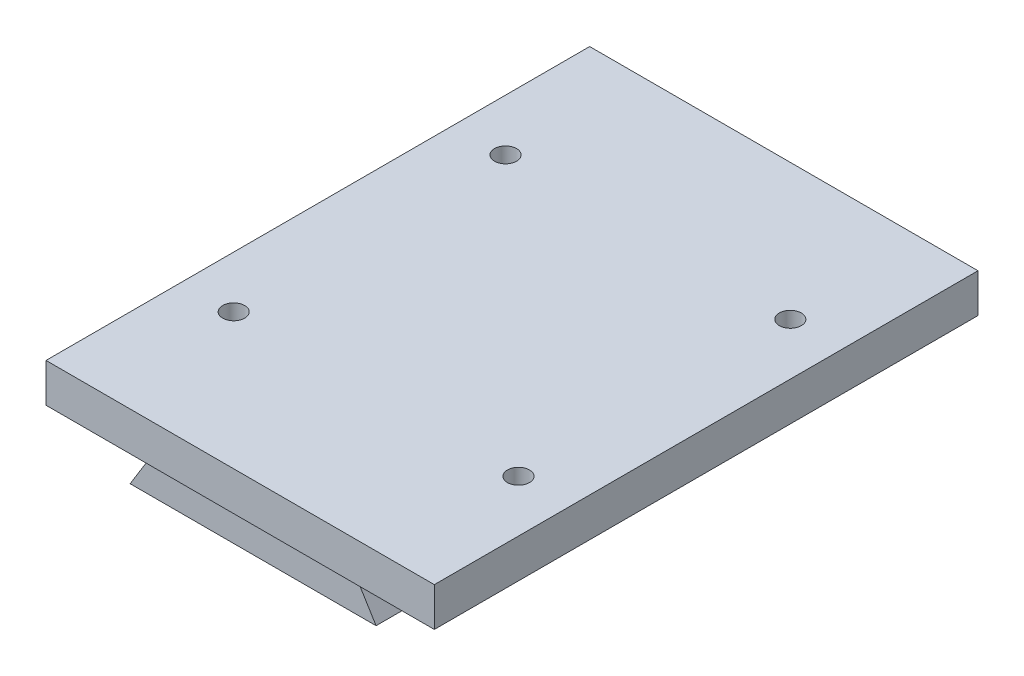
ISO-10303-21;
HEADER;
FILE_DESCRIPTION(('STEP AP214'),'2;1');
FILE_NAME('part.step','',(''),(''),'','','');
FILE_SCHEMA(('AUTOMOTIVE_DESIGN { 1 0 10303 214 1 1 1 1 }'));
ENDSEC;
DATA;
#1=APPLICATION_CONTEXT('core data for automotive mechanical design processes');
#2=APPLICATION_PROTOCOL_DEFINITION('international standard','automotive_design',2000,#1);
#3=PRODUCT_CONTEXT('',#1,'mechanical');
#4=PRODUCT('Part','Part','',(#3));
#5=PRODUCT_RELATED_PRODUCT_CATEGORY('part','',(#4));
#6=PRODUCT_DEFINITION_FORMATION('','',#4);
#7=PRODUCT_DEFINITION_CONTEXT('part definition',#1,'design');
#8=PRODUCT_DEFINITION('design','',#6,#7);
#9=PRODUCT_DEFINITION_SHAPE('','',#8);
#10=(LENGTH_UNIT() NAMED_UNIT(*) SI_UNIT(.MILLI.,.METRE.));
#11=(NAMED_UNIT(*) PLANE_ANGLE_UNIT() SI_UNIT($,.RADIAN.));
#12=(NAMED_UNIT(*) SI_UNIT($,.STERADIAN.) SOLID_ANGLE_UNIT());
#13=UNCERTAINTY_MEASURE_WITH_UNIT(LENGTH_MEASURE(1.E-05),#10,'distance_accuracy_value','');
#14=(GEOMETRIC_REPRESENTATION_CONTEXT(3) GLOBAL_UNCERTAINTY_ASSIGNED_CONTEXT((#13)) GLOBAL_UNIT_ASSIGNED_CONTEXT((#10,
#11,#12)) REPRESENTATION_CONTEXT('',''));
#15=CARTESIAN_POINT('',(0.,0.,0.));
#16=DIRECTION('',(0.,0.,1.));
#17=DIRECTION('',(1.,0.,0.));
#18=AXIS2_PLACEMENT_3D('',#15,#16,#17);
#19=CARTESIAN_POINT('',(0.,-34.4,0.));
#20=DIRECTION('',(0.,1.,0.));
#21=DIRECTION('',(0.,0.,1.));
#22=AXIS2_PLACEMENT_3D('',#19,#20,#21);
#23=PLANE('',#22);
#24=CARTESIAN_POINT('',(-22.,-34.4,49.));
#25=DIRECTION('',(0.,1.,0.));
#26=DIRECTION('',(0.,0.,1.));
#27=AXIS2_PLACEMENT_3D('',#24,#25,#26);
#28=CIRCLE('',#27,3.);
#29=CARTESIAN_POINT('',(-22.,-34.4,52.));
#30=VERTEX_POINT('',#29);
#31=EDGE_CURVE('E43',#30,#30,#28,.F.);
#32=ORIENTED_EDGE('',*,*,#31,.F.);
#33=EDGE_LOOP('',(#32));
#34=FACE_BOUND('',#33,.T.);
#35=CARTESIAN_POINT('',(22.,-34.4,91.));
#36=DIRECTION('',(0.,1.,0.));
#37=DIRECTION('',(0.,0.,1.));
#38=AXIS2_PLACEMENT_3D('',#35,#36,#37);
#39=CIRCLE('',#38,3.);
#40=CARTESIAN_POINT('',(22.,-34.4,94.));
#41=VERTEX_POINT('',#40);
#42=EDGE_CURVE('E199',#41,#41,#39,.F.);
#43=ORIENTED_EDGE('',*,*,#42,.F.);
#44=EDGE_LOOP('',(#43));
#45=FACE_BOUND('',#44,.T.);
#46=CARTESIAN_POINT('',(22.,-34.4,49.));
#47=DIRECTION('',(0.,1.,0.));
#48=DIRECTION('',(0.,0.,1.));
#49=AXIS2_PLACEMENT_3D('',#46,#47,#48);
#50=CIRCLE('',#49,3.);
#51=CARTESIAN_POINT('',(22.,-34.4,52.));
#52=VERTEX_POINT('',#51);
#53=EDGE_CURVE('E197',#52,#52,#50,.F.);
#54=ORIENTED_EDGE('',*,*,#53,.F.);
#55=EDGE_LOOP('',(#54));
#56=FACE_BOUND('',#55,.T.);
#57=CARTESIAN_POINT('',(-22.,-34.4,91.));
#58=DIRECTION('',(0.,1.,0.));
#59=DIRECTION('',(0.,0.,1.));
#60=AXIS2_PLACEMENT_3D('',#57,#58,#59);
#61=CIRCLE('',#60,3.);
#62=CARTESIAN_POINT('',(-22.,-34.4,94.));
#63=VERTEX_POINT('',#62);
#64=EDGE_CURVE('E194',#63,#63,#61,.F.);
#65=ORIENTED_EDGE('',*,*,#64,.F.);
#66=EDGE_LOOP('',(#65));
#67=FACE_BOUND('',#66,.T.);
#68=DIRECTION('',(0.,0.,1.));
#69=VECTOR('',#68,1.);
#70=CARTESIAN_POINT('',(-30.,-34.4,28.));
#71=LINE('',#70,#69);
#72=CARTESIAN_POINT('',(-30.,-34.4,28.));
#73=VERTEX_POINT('',#72);
#74=CARTESIAN_POINT('',(-30.,-34.4,112.));
#75=VERTEX_POINT('',#74);
#76=EDGE_CURVE('E136',#73,#75,#71,.T.);
#77=ORIENTED_EDGE('',*,*,#76,.F.);
#78=DIRECTION('',(-1.,0.,0.));
#79=VECTOR('',#78,1.);
#80=CARTESIAN_POINT('',(30.,-34.4,28.));
#81=LINE('',#80,#79);
#82=CARTESIAN_POINT('',(30.,-34.4,28.));
#83=VERTEX_POINT('',#82);
#84=EDGE_CURVE('E86',#83,#73,#81,.T.);
#85=ORIENTED_EDGE('',*,*,#84,.F.);
#86=DIRECTION('',(0.,0.,-1.));
#87=VECTOR('',#86,1.);
#88=CARTESIAN_POINT('',(30.,-34.4,112.));
#89=LINE('',#88,#87);
#90=CARTESIAN_POINT('',(30.,-34.4,112.));
#91=VERTEX_POINT('',#90);
#92=EDGE_CURVE('E152',#91,#83,#89,.T.);
#93=ORIENTED_EDGE('',*,*,#92,.F.);
#94=DIRECTION('',(1.,0.,0.));
#95=VECTOR('',#94,1.);
#96=CARTESIAN_POINT('',(-30.,-34.4,112.));
#97=LINE('',#96,#95);
#98=EDGE_CURVE('E139',#75,#91,#97,.T.);
#99=ORIENTED_EDGE('',*,*,#98,.F.);
#100=EDGE_LOOP('',(#77,#85,#93,#99));
#101=FACE_BOUND('',#100,.T.);
#102=DIRECTION('',(-1.,0.,0.));
#103=VECTOR('',#102,1.);
#104=CARTESIAN_POINT('',(0.,-34.4,110.));
#105=LINE('',#104,#103);
#106=CARTESIAN_POINT('',(15.3076923076923,-34.4,110.));
#107=VERTEX_POINT('',#106);
#108=CARTESIAN_POINT('',(-15.3076923076923,-34.4,110.));
#109=VERTEX_POINT('',#108);
#110=EDGE_CURVE('E11',#107,#109,#105,.T.);
#111=ORIENTED_EDGE('',*,*,#110,.F.);
#112=DIRECTION('',(0.,0.,1.));
#113=VECTOR('',#112,1.);
#114=CARTESIAN_POINT('',(15.3076923076923,-34.4,0.));
#115=LINE('',#114,#113);
#116=CARTESIAN_POINT('',(15.3076923076923,-34.4,30.));
#117=VERTEX_POINT('',#116);
#118=EDGE_CURVE('E166',#117,#107,#115,.T.);
#119=ORIENTED_EDGE('',*,*,#118,.F.);
#120=DIRECTION('',(-1.,0.,0.));
#121=VECTOR('',#120,1.);
#122=CARTESIAN_POINT('',(0.,-34.4,30.));
#123=LINE('',#122,#121);
#124=CARTESIAN_POINT('',(-15.3076923076923,-34.4,30.));
#125=VERTEX_POINT('',#124);
#126=EDGE_CURVE('E163',#117,#125,#123,.T.);
#127=ORIENTED_EDGE('',*,*,#126,.T.);
#128=DIRECTION('',(0.,0.,-1.));
#129=VECTOR('',#128,1.);
#130=CARTESIAN_POINT('',(-15.3076923076923,-34.4,0.));
#131=LINE('',#130,#129);
#132=EDGE_CURVE('E48',#109,#125,#131,.T.);
#133=ORIENTED_EDGE('',*,*,#132,.F.);
#134=EDGE_LOOP('',(#111,#119,#127,#133));
#135=FACE_BOUND('',#134,.T.);
#136=ADVANCED_FACE('F39',(#34,#45,#56,#67,#101,#135),#23,.F.);
#137=CARTESIAN_POINT('',(-30.,-28.4,28.));
#138=DIRECTION('',(1.,0.,0.));
#139=DIRECTION('',(0.,0.,-1.));
#140=AXIS2_PLACEMENT_3D('',#137,#138,#139);
#141=PLANE('',#140);
#142=ORIENTED_EDGE('',*,*,#76,.T.);
#143=DIRECTION('',(0.,-1.,0.));
#144=VECTOR('',#143,1.);
#145=CARTESIAN_POINT('',(-30.,-28.4,112.));
#146=LINE('',#145,#144);
#147=CARTESIAN_POINT('',(-30.,-28.4,112.));
#148=VERTEX_POINT('',#147);
#149=EDGE_CURVE('E161',#148,#75,#146,.T.);
#150=ORIENTED_EDGE('',*,*,#149,.F.);
#151=DIRECTION('',(0.,0.,1.));
#152=VECTOR('',#151,1.);
#153=CARTESIAN_POINT('',(-30.,-28.4,28.));
#154=LINE('',#153,#152);
#155=CARTESIAN_POINT('',(-30.,-28.4,28.));
#156=VERTEX_POINT('',#155);
#157=EDGE_CURVE('E144',#156,#148,#154,.T.);
#158=ORIENTED_EDGE('',*,*,#157,.F.);
#159=DIRECTION('',(0.,-1.,0.));
#160=VECTOR('',#159,1.);
#161=CARTESIAN_POINT('',(-30.,-28.4,28.));
#162=LINE('',#161,#160);
#163=EDGE_CURVE('E149',#156,#73,#162,.T.);
#164=ORIENTED_EDGE('',*,*,#163,.T.);
#165=EDGE_LOOP('',(#142,#150,#158,#164));
#166=FACE_BOUND('',#165,.T.);
#167=ADVANCED_FACE('F41',(#166),#141,.F.);
#168=CARTESIAN_POINT('',(-30.,-28.4,112.));
#169=DIRECTION('',(0.,0.,-1.));
#170=DIRECTION('',(-1.,0.,0.));
#171=AXIS2_PLACEMENT_3D('',#168,#169,#170);
#172=PLANE('',#171);
#173=ORIENTED_EDGE('',*,*,#98,.T.);
#174=DIRECTION('',(0.,-1.,0.));
#175=VECTOR('',#174,1.);
#176=CARTESIAN_POINT('',(30.,-28.4,112.));
#177=LINE('',#176,#175);
#178=CARTESIAN_POINT('',(30.,-28.4,112.));
#179=VERTEX_POINT('',#178);
#180=EDGE_CURVE('E158',#179,#91,#177,.T.);
#181=ORIENTED_EDGE('',*,*,#180,.F.);
#182=DIRECTION('',(1.,0.,0.));
#183=VECTOR('',#182,1.);
#184=CARTESIAN_POINT('',(-30.,-28.4,112.));
#185=LINE('',#184,#183);
#186=EDGE_CURVE('E94',#148,#179,#185,.T.);
#187=ORIENTED_EDGE('',*,*,#186,.F.);
#188=ORIENTED_EDGE('',*,*,#149,.T.);
#189=EDGE_LOOP('',(#173,#181,#187,#188));
#190=FACE_BOUND('',#189,.T.);
#191=ADVANCED_FACE('F311',(#190),#172,.F.);
#192=CARTESIAN_POINT('',(30.,-28.4,112.));
#193=DIRECTION('',(-1.,0.,0.));
#194=DIRECTION('',(0.,0.,1.));
#195=AXIS2_PLACEMENT_3D('',#192,#193,#194);
#196=PLANE('',#195);
#197=ORIENTED_EDGE('',*,*,#92,.T.);
#198=DIRECTION('',(0.,-1.,0.));
#199=VECTOR('',#198,1.);
#200=CARTESIAN_POINT('',(30.,-28.4,28.));
#201=LINE('',#200,#199);
#202=CARTESIAN_POINT('',(30.,-28.4,28.));
#203=VERTEX_POINT('',#202);
#204=EDGE_CURVE('E156',#203,#83,#201,.T.);
#205=ORIENTED_EDGE('',*,*,#204,.F.);
#206=DIRECTION('',(0.,0.,-1.));
#207=VECTOR('',#206,1.);
#208=CARTESIAN_POINT('',(30.,-28.4,112.));
#209=LINE('',#208,#207);
#210=EDGE_CURVE('E147',#179,#203,#209,.T.);
#211=ORIENTED_EDGE('',*,*,#210,.F.);
#212=ORIENTED_EDGE('',*,*,#180,.T.);
#213=EDGE_LOOP('',(#197,#205,#211,#212));
#214=FACE_BOUND('',#213,.T.);
#215=ADVANCED_FACE('F309',(#214),#196,.F.);
#216=CARTESIAN_POINT('',(30.,-28.4,28.));
#217=DIRECTION('',(0.,0.,1.));
#218=DIRECTION('',(1.,0.,0.));
#219=AXIS2_PLACEMENT_3D('',#216,#217,#218);
#220=PLANE('',#219);
#221=ORIENTED_EDGE('',*,*,#84,.T.);
#222=ORIENTED_EDGE('',*,*,#163,.F.);
#223=DIRECTION('',(-1.,0.,0.));
#224=VECTOR('',#223,1.);
#225=CARTESIAN_POINT('',(30.,-28.4,28.));
#226=LINE('',#225,#224);
#227=EDGE_CURVE('E65',#203,#156,#226,.T.);
#228=ORIENTED_EDGE('',*,*,#227,.F.);
#229=ORIENTED_EDGE('',*,*,#204,.T.);
#230=EDGE_LOOP('',(#221,#222,#228,#229));
#231=FACE_BOUND('',#230,.T.);
#232=ADVANCED_FACE('F304',(#231),#220,.F.);
#233=CARTESIAN_POINT('',(0.,-28.4,0.));
#234=DIRECTION('',(0.,1.,0.));
#235=DIRECTION('',(0.,0.,1.));
#236=AXIS2_PLACEMENT_3D('',#233,#234,#235);
#237=PLANE('',#236);
#238=CARTESIAN_POINT('',(-22.,-28.4,49.));
#239=DIRECTION('',(0.,1.,0.));
#240=DIRECTION('',(0.,0.,1.));
#241=AXIS2_PLACEMENT_3D('',#238,#239,#240);
#242=CIRCLE('',#241,1.7);
#243=CARTESIAN_POINT('',(-22.,-28.4,50.7));
#244=VERTEX_POINT('',#243);
#245=EDGE_CURVE('E178',#244,#244,#242,.F.);
#246=ORIENTED_EDGE('',*,*,#245,.T.);
#247=EDGE_LOOP('',(#246));
#248=FACE_BOUND('',#247,.T.);
#249=CARTESIAN_POINT('',(22.,-28.4,91.));
#250=DIRECTION('',(0.,1.,0.));
#251=DIRECTION('',(0.,0.,1.));
#252=AXIS2_PLACEMENT_3D('',#249,#250,#251);
#253=CIRCLE('',#252,1.7);
#254=CARTESIAN_POINT('',(22.,-28.4,92.7));
#255=VERTEX_POINT('',#254);
#256=EDGE_CURVE('E175',#255,#255,#253,.F.);
#257=ORIENTED_EDGE('',*,*,#256,.T.);
#258=EDGE_LOOP('',(#257));
#259=FACE_BOUND('',#258,.T.);
#260=CARTESIAN_POINT('',(22.,-28.4,49.));
#261=DIRECTION('',(0.,1.,0.));
#262=DIRECTION('',(0.,0.,1.));
#263=AXIS2_PLACEMENT_3D('',#260,#261,#262);
#264=CIRCLE('',#263,1.7);
#265=CARTESIAN_POINT('',(22.,-28.4,50.7));
#266=VERTEX_POINT('',#265);
#267=EDGE_CURVE('E172',#266,#266,#264,.F.);
#268=ORIENTED_EDGE('',*,*,#267,.T.);
#269=EDGE_LOOP('',(#268));
#270=FACE_BOUND('',#269,.T.);
#271=CARTESIAN_POINT('',(-22.,-28.4,91.));
#272=DIRECTION('',(0.,1.,0.));
#273=DIRECTION('',(0.,0.,1.));
#274=AXIS2_PLACEMENT_3D('',#271,#272,#273);
#275=CIRCLE('',#274,1.7);
#276=CARTESIAN_POINT('',(-22.,-28.4,92.7));
#277=VERTEX_POINT('',#276);
#278=EDGE_CURVE('E169',#277,#277,#275,.F.);
#279=ORIENTED_EDGE('',*,*,#278,.T.);
#280=EDGE_LOOP('',(#279));
#281=FACE_BOUND('',#280,.T.);
#282=ORIENTED_EDGE('',*,*,#157,.T.);
#283=ORIENTED_EDGE('',*,*,#186,.T.);
#284=ORIENTED_EDGE('',*,*,#210,.T.);
#285=ORIENTED_EDGE('',*,*,#227,.T.);
#286=EDGE_LOOP('',(#282,#283,#284,#285));
#287=FACE_BOUND('',#286,.T.);
#288=ADVANCED_FACE('F302',(#248,#259,#270,#281,#287),#237,.T.);
#289=CARTESIAN_POINT('',(-19.,-40.4,110.));
#290=DIRECTION('',(0.851658316704544,-0.524097425664335,0.));
#291=DIRECTION('',(0.524097425664335,0.851658316704544,0.));
#292=AXIS2_PLACEMENT_3D('',#289,#290,#291);
#293=PLANE('',#292);
#294=DIRECTION('',(-0.524097425664335,-0.851658316704544,0.));
#295=VECTOR('',#294,1.);
#296=CARTESIAN_POINT('',(-19.,-40.4,110.));
#297=LINE('',#296,#295);
#298=CARTESIAN_POINT('',(-19.,-40.4,110.));
#299=VERTEX_POINT('',#298);
#300=EDGE_CURVE('E114',#109,#299,#297,.T.);
#301=ORIENTED_EDGE('',*,*,#300,.F.);
#302=ORIENTED_EDGE('',*,*,#132,.T.);
#303=DIRECTION('',(-0.524097425664335,-0.851658316704544,0.));
#304=VECTOR('',#303,1.);
#305=CARTESIAN_POINT('',(-19.,-40.4,30.));
#306=LINE('',#305,#304);
#307=CARTESIAN_POINT('',(-19.,-40.4,30.));
#308=VERTEX_POINT('',#307);
#309=EDGE_CURVE('E56',#125,#308,#306,.T.);
#310=ORIENTED_EDGE('',*,*,#309,.T.);
#311=DIRECTION('',(0.,0.,-1.));
#312=VECTOR('',#311,1.);
#313=CARTESIAN_POINT('',(-19.,-40.4,110.));
#314=LINE('',#313,#312);
#315=EDGE_CURVE('E129',#299,#308,#314,.T.);
#316=ORIENTED_EDGE('',*,*,#315,.F.);
#317=EDGE_LOOP('',(#301,#302,#310,#316));
#318=FACE_BOUND('',#317,.T.);
#319=ADVANCED_FACE('F135',(#318),#293,.F.);
#320=CARTESIAN_POINT('',(15.,-33.9,110.));
#321=DIRECTION('',(-0.851658316704544,-0.524097425664335,0.));
#322=DIRECTION('',(0.524097425664335,-0.851658316704544,0.));
#323=AXIS2_PLACEMENT_3D('',#320,#321,#322);
#324=PLANE('',#323);
#325=DIRECTION('',(-0.524097425664335,0.851658316704544,0.));
#326=VECTOR('',#325,1.);
#327=CARTESIAN_POINT('',(15.,-33.9,30.));
#328=LINE('',#327,#326);
#329=CARTESIAN_POINT('',(19.,-40.4,30.));
#330=VERTEX_POINT('',#329);
#331=EDGE_CURVE('E124',#330,#117,#328,.T.);
#332=ORIENTED_EDGE('',*,*,#331,.T.);
#333=ORIENTED_EDGE('',*,*,#118,.T.);
#334=DIRECTION('',(-0.524097425664335,0.851658316704544,0.));
#335=VECTOR('',#334,1.);
#336=CARTESIAN_POINT('',(15.,-33.9,110.));
#337=LINE('',#336,#335);
#338=CARTESIAN_POINT('',(19.,-40.4,110.));
#339=VERTEX_POINT('',#338);
#340=EDGE_CURVE('E133',#339,#107,#337,.T.);
#341=ORIENTED_EDGE('',*,*,#340,.F.);
#342=DIRECTION('',(0.,0.,-1.));
#343=VECTOR('',#342,1.);
#344=CARTESIAN_POINT('',(19.,-40.4,110.));
#345=LINE('',#344,#343);
#346=EDGE_CURVE('E131',#339,#330,#345,.T.);
#347=ORIENTED_EDGE('',*,*,#346,.T.);
#348=EDGE_LOOP('',(#332,#333,#341,#347));
#349=FACE_BOUND('',#348,.T.);
#350=ADVANCED_FACE('F223',(#349),#324,.F.);
#351=CARTESIAN_POINT('',(0.,0.,110.));
#352=DIRECTION('',(0.,0.,-1.));
#353=DIRECTION('',(-1.,0.,0.));
#354=AXIS2_PLACEMENT_3D('',#351,#352,#353);
#355=PLANE('',#354);
#356=ORIENTED_EDGE('',*,*,#340,.T.);
#357=ORIENTED_EDGE('',*,*,#110,.T.);
#358=ORIENTED_EDGE('',*,*,#300,.T.);
#359=DIRECTION('',(1.,0.,0.));
#360=VECTOR('',#359,1.);
#361=CARTESIAN_POINT('',(19.,-40.4,110.));
#362=LINE('',#361,#360);
#363=EDGE_CURVE('E118',#299,#339,#362,.T.);
#364=ORIENTED_EDGE('',*,*,#363,.T.);
#365=EDGE_LOOP('',(#356,#357,#358,#364));
#366=FACE_BOUND('',#365,.T.);
#367=ADVANCED_FACE('F117',(#366),#355,.F.);
#368=CARTESIAN_POINT('',(0.,0.,30.));
#369=DIRECTION('',(0.,0.,-1.));
#370=DIRECTION('',(-1.,0.,0.));
#371=AXIS2_PLACEMENT_3D('',#368,#369,#370);
#372=PLANE('',#371);
#373=ORIENTED_EDGE('',*,*,#126,.F.);
#374=ORIENTED_EDGE('',*,*,#331,.F.);
#375=DIRECTION('',(1.,0.,0.));
#376=VECTOR('',#375,1.);
#377=CARTESIAN_POINT('',(19.,-40.4,30.));
#378=LINE('',#377,#376);
#379=EDGE_CURVE('E224',#308,#330,#378,.T.);
#380=ORIENTED_EDGE('',*,*,#379,.F.);
#381=ORIENTED_EDGE('',*,*,#309,.F.);
#382=EDGE_LOOP('',(#373,#374,#380,#381));
#383=FACE_BOUND('',#382,.T.);
#384=ADVANCED_FACE('F221',(#383),#372,.T.);
#385=CARTESIAN_POINT('',(19.,-40.4,110.));
#386=DIRECTION('',(0.,1.,0.));
#387=DIRECTION('',(0.,0.,1.));
#388=AXIS2_PLACEMENT_3D('',#385,#386,#387);
#389=PLANE('',#388);
#390=ORIENTED_EDGE('',*,*,#379,.T.);
#391=ORIENTED_EDGE('',*,*,#346,.F.);
#392=ORIENTED_EDGE('',*,*,#363,.F.);
#393=ORIENTED_EDGE('',*,*,#315,.T.);
#394=EDGE_LOOP('',(#390,#391,#392,#393));
#395=FACE_BOUND('',#394,.T.);
#396=ADVANCED_FACE('F128',(#395),#389,.F.);
#397=CARTESIAN_POINT('',(-22.,-27.9,91.));
#398=DIRECTION('',(0.,-1.,0.));
#399=DIRECTION('',(0.,0.,-1.));
#400=AXIS2_PLACEMENT_3D('',#397,#398,#399);
#401=CYLINDRICAL_SURFACE('',#400,1.7);
#402=CARTESIAN_POINT('',(-22.,-30.9,91.));
#403=DIRECTION('',(0.,1.,0.));
#404=DIRECTION('',(0.,0.,1.));
#405=AXIS2_PLACEMENT_3D('',#402,#403,#404);
#406=CIRCLE('',#405,1.7);
#407=CARTESIAN_POINT('',(-22.,-30.9,92.7));
#408=VERTEX_POINT('',#407);
#409=EDGE_CURVE('E191',#408,#408,#406,.T.);
#410=ORIENTED_EDGE('',*,*,#409,.F.);
#411=EDGE_LOOP('',(#410));
#412=FACE_BOUND('',#411,.T.);
#413=ORIENTED_EDGE('',*,*,#278,.F.);
#414=EDGE_LOOP('',(#413));
#415=FACE_BOUND('',#414,.T.);
#416=ADVANCED_FACE('F281',(#412,#415),#401,.F.);
#417=CARTESIAN_POINT('',(22.,-27.9,49.));
#418=DIRECTION('',(0.,-1.,0.));
#419=DIRECTION('',(0.,0.,-1.));
#420=AXIS2_PLACEMENT_3D('',#417,#418,#419);
#421=CYLINDRICAL_SURFACE('',#420,1.7);
#422=CARTESIAN_POINT('',(22.,-30.9,49.));
#423=DIRECTION('',(0.,1.,0.));
#424=DIRECTION('',(0.,0.,1.));
#425=AXIS2_PLACEMENT_3D('',#422,#423,#424);
#426=CIRCLE('',#425,1.7);
#427=CARTESIAN_POINT('',(22.,-30.9,50.7));
#428=VERTEX_POINT('',#427);
#429=EDGE_CURVE('E188',#428,#428,#426,.T.);
#430=ORIENTED_EDGE('',*,*,#429,.F.);
#431=EDGE_LOOP('',(#430));
#432=FACE_BOUND('',#431,.T.);
#433=ORIENTED_EDGE('',*,*,#267,.F.);
#434=EDGE_LOOP('',(#433));
#435=FACE_BOUND('',#434,.T.);
#436=ADVANCED_FACE('F277',(#432,#435),#421,.F.);
#437=CARTESIAN_POINT('',(22.,-27.9,91.));
#438=DIRECTION('',(0.,-1.,0.));
#439=DIRECTION('',(0.,0.,-1.));
#440=AXIS2_PLACEMENT_3D('',#437,#438,#439);
#441=CYLINDRICAL_SURFACE('',#440,1.7);
#442=CARTESIAN_POINT('',(22.,-30.9,91.));
#443=DIRECTION('',(0.,1.,0.));
#444=DIRECTION('',(0.,0.,1.));
#445=AXIS2_PLACEMENT_3D('',#442,#443,#444);
#446=CIRCLE('',#445,1.7);
#447=CARTESIAN_POINT('',(22.,-30.9,92.7));
#448=VERTEX_POINT('',#447);
#449=EDGE_CURVE('E184',#448,#448,#446,.T.);
#450=ORIENTED_EDGE('',*,*,#449,.F.);
#451=EDGE_LOOP('',(#450));
#452=FACE_BOUND('',#451,.T.);
#453=ORIENTED_EDGE('',*,*,#256,.F.);
#454=EDGE_LOOP('',(#453));
#455=FACE_BOUND('',#454,.T.);
#456=ADVANCED_FACE('F280',(#452,#455),#441,.F.);
#457=CARTESIAN_POINT('',(-22.,-27.9,49.));
#458=DIRECTION('',(0.,-1.,0.));
#459=DIRECTION('',(0.,0.,-1.));
#460=AXIS2_PLACEMENT_3D('',#457,#458,#459);
#461=CYLINDRICAL_SURFACE('',#460,1.7);
#462=CARTESIAN_POINT('',(-22.,-30.9,49.));
#463=DIRECTION('',(0.,1.,0.));
#464=DIRECTION('',(0.,0.,1.));
#465=AXIS2_PLACEMENT_3D('',#462,#463,#464);
#466=CIRCLE('',#465,1.7);
#467=CARTESIAN_POINT('',(-22.,-30.9,50.7));
#468=VERTEX_POINT('',#467);
#469=EDGE_CURVE('E181',#468,#468,#466,.T.);
#470=ORIENTED_EDGE('',*,*,#469,.F.);
#471=EDGE_LOOP('',(#470));
#472=FACE_BOUND('',#471,.T.);
#473=ORIENTED_EDGE('',*,*,#245,.F.);
#474=EDGE_LOOP('',(#473));
#475=FACE_BOUND('',#474,.T.);
#476=ADVANCED_FACE('F262',(#472,#475),#461,.F.);
#477=CARTESIAN_POINT('',(-22.,-30.9,49.));
#478=DIRECTION('',(0.,-1.,0.));
#479=DIRECTION('',(0.,0.,-1.));
#480=AXIS2_PLACEMENT_3D('',#477,#478,#479);
#481=CYLINDRICAL_SURFACE('',#480,3.);
#482=CARTESIAN_POINT('',(-22.,-30.9,49.));
#483=DIRECTION('',(0.,1.,0.));
#484=DIRECTION('',(0.,0.,1.));
#485=AXIS2_PLACEMENT_3D('',#482,#483,#484);
#486=CIRCLE('',#485,3.);
#487=CARTESIAN_POINT('',(-22.,-30.9,52.));
#488=VERTEX_POINT('',#487);
#489=EDGE_CURVE('E231',#488,#488,#486,.T.);
#490=ORIENTED_EDGE('',*,*,#489,.T.);
#491=EDGE_LOOP('',(#490));
#492=FACE_BOUND('',#491,.T.);
#493=ORIENTED_EDGE('',*,*,#31,.T.);
#494=EDGE_LOOP('',(#493));
#495=FACE_BOUND('',#494,.T.);
#496=ADVANCED_FACE('F206',(#492,#495),#481,.F.);
#497=CARTESIAN_POINT('',(-22.,-30.9,49.));
#498=DIRECTION('',(0.,1.,0.));
#499=DIRECTION('',(0.,0.,1.));
#500=AXIS2_PLACEMENT_3D('',#497,#498,#499);
#501=PLANE('',#500);
#502=ORIENTED_EDGE('',*,*,#469,.T.);
#503=EDGE_LOOP('',(#502));
#504=FACE_BOUND('',#503,.T.);
#505=ORIENTED_EDGE('',*,*,#489,.F.);
#506=EDGE_LOOP('',(#505));
#507=FACE_BOUND('',#506,.T.);
#508=ADVANCED_FACE('F261',(#504,#507),#501,.F.);
#509=CARTESIAN_POINT('',(22.,-30.9,91.));
#510=DIRECTION('',(0.,-1.,0.));
#511=DIRECTION('',(0.,0.,-1.));
#512=AXIS2_PLACEMENT_3D('',#509,#510,#511);
#513=CYLINDRICAL_SURFACE('',#512,3.);
#514=CARTESIAN_POINT('',(22.,-30.9,91.));
#515=DIRECTION('',(0.,1.,0.));
#516=DIRECTION('',(0.,0.,1.));
#517=AXIS2_PLACEMENT_3D('',#514,#515,#516);
#518=CIRCLE('',#517,3.);
#519=CARTESIAN_POINT('',(22.,-30.9,94.));
#520=VERTEX_POINT('',#519);
#521=EDGE_CURVE('E232',#520,#520,#518,.T.);
#522=ORIENTED_EDGE('',*,*,#521,.T.);
#523=EDGE_LOOP('',(#522));
#524=FACE_BOUND('',#523,.T.);
#525=ORIENTED_EDGE('',*,*,#42,.T.);
#526=EDGE_LOOP('',(#525));
#527=FACE_BOUND('',#526,.T.);
#528=ADVANCED_FACE('F266',(#524,#527),#513,.F.);
#529=CARTESIAN_POINT('',(22.,-30.9,91.));
#530=DIRECTION('',(0.,1.,0.));
#531=DIRECTION('',(0.,0.,1.));
#532=AXIS2_PLACEMENT_3D('',#529,#530,#531);
#533=PLANE('',#532);
#534=ORIENTED_EDGE('',*,*,#449,.T.);
#535=EDGE_LOOP('',(#534));
#536=FACE_BOUND('',#535,.T.);
#537=ORIENTED_EDGE('',*,*,#521,.F.);
#538=EDGE_LOOP('',(#537));
#539=FACE_BOUND('',#538,.T.);
#540=ADVANCED_FACE('F256',(#536,#539),#533,.F.);
#541=CARTESIAN_POINT('',(22.,-30.9,49.));
#542=DIRECTION('',(0.,-1.,0.));
#543=DIRECTION('',(0.,0.,-1.));
#544=AXIS2_PLACEMENT_3D('',#541,#542,#543);
#545=CYLINDRICAL_SURFACE('',#544,3.);
#546=CARTESIAN_POINT('',(22.,-30.9,49.));
#547=DIRECTION('',(0.,1.,0.));
#548=DIRECTION('',(0.,0.,1.));
#549=AXIS2_PLACEMENT_3D('',#546,#547,#548);
#550=CIRCLE('',#549,3.);
#551=CARTESIAN_POINT('',(22.,-30.9,52.));
#552=VERTEX_POINT('',#551);
#553=EDGE_CURVE('E235',#552,#552,#550,.T.);
#554=ORIENTED_EDGE('',*,*,#553,.T.);
#555=EDGE_LOOP('',(#554));
#556=FACE_BOUND('',#555,.T.);
#557=ORIENTED_EDGE('',*,*,#53,.T.);
#558=EDGE_LOOP('',(#557));
#559=FACE_BOUND('',#558,.T.);
#560=ADVANCED_FACE('F241',(#556,#559),#545,.F.);
#561=CARTESIAN_POINT('',(22.,-30.9,49.));
#562=DIRECTION('',(0.,1.,0.));
#563=DIRECTION('',(0.,0.,1.));
#564=AXIS2_PLACEMENT_3D('',#561,#562,#563);
#565=PLANE('',#564);
#566=ORIENTED_EDGE('',*,*,#429,.T.);
#567=EDGE_LOOP('',(#566));
#568=FACE_BOUND('',#567,.T.);
#569=ORIENTED_EDGE('',*,*,#553,.F.);
#570=EDGE_LOOP('',(#569));
#571=FACE_BOUND('',#570,.T.);
#572=ADVANCED_FACE('F244',(#568,#571),#565,.F.);
#573=CARTESIAN_POINT('',(-22.,-30.9,91.));
#574=DIRECTION('',(0.,-1.,0.));
#575=DIRECTION('',(0.,0.,-1.));
#576=AXIS2_PLACEMENT_3D('',#573,#574,#575);
#577=CYLINDRICAL_SURFACE('',#576,3.);
#578=CARTESIAN_POINT('',(-22.,-30.9,91.));
#579=DIRECTION('',(0.,1.,0.));
#580=DIRECTION('',(0.,0.,1.));
#581=AXIS2_PLACEMENT_3D('',#578,#579,#580);
#582=CIRCLE('',#581,3.);
#583=CARTESIAN_POINT('',(-22.,-30.9,94.));
#584=VERTEX_POINT('',#583);
#585=EDGE_CURVE('E185',#584,#584,#582,.T.);
#586=ORIENTED_EDGE('',*,*,#585,.T.);
#587=EDGE_LOOP('',(#586));
#588=FACE_BOUND('',#587,.T.);
#589=ORIENTED_EDGE('',*,*,#64,.T.);
#590=EDGE_LOOP('',(#589));
#591=FACE_BOUND('',#590,.T.);
#592=ADVANCED_FACE('F246',(#588,#591),#577,.F.);
#593=CARTESIAN_POINT('',(-22.,-30.9,91.));
#594=DIRECTION('',(0.,1.,0.));
#595=DIRECTION('',(0.,0.,1.));
#596=AXIS2_PLACEMENT_3D('',#593,#594,#595);
#597=PLANE('',#596);
#598=ORIENTED_EDGE('',*,*,#409,.T.);
#599=EDGE_LOOP('',(#598));
#600=FACE_BOUND('',#599,.T.);
#601=ORIENTED_EDGE('',*,*,#585,.F.);
#602=EDGE_LOOP('',(#601));
#603=FACE_BOUND('',#602,.T.);
#604=ADVANCED_FACE('F253',(#600,#603),#597,.F.);
#605=CLOSED_SHELL('',(#136,#167,#191,#215,#232,#288,#319,#350,#367,#384,#396,#416,#436,#456,
#476,#496,#508,#528,#540,#560,#572,#592,#604));
#606=MANIFOLD_SOLID_BREP('B2',#605);
#607=ADVANCED_BREP_SHAPE_REPRESENTATION('',(#18,#606),#14);
#608=SHAPE_DEFINITION_REPRESENTATION(#9,#607);
ENDSEC;
END-ISO-10303-21;
